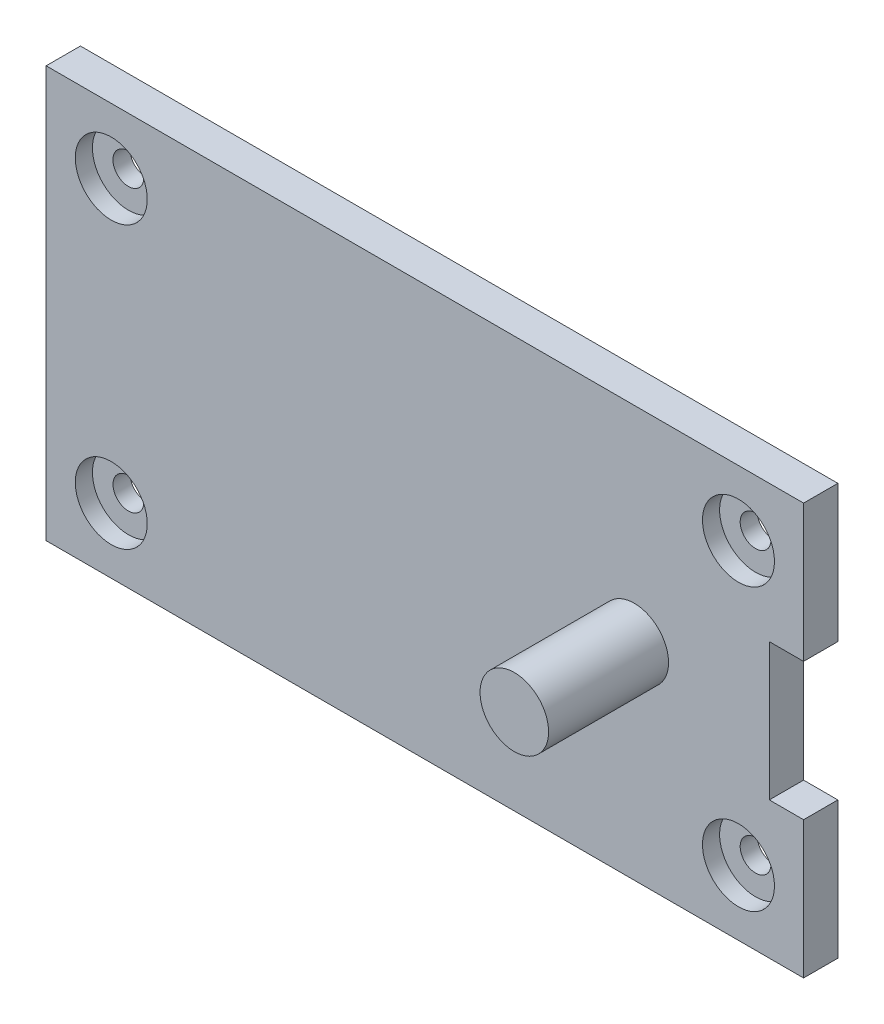
ISO-10303-21;
HEADER;
FILE_DESCRIPTION(('STEP AP214'),'2;1');
FILE_NAME('part.step','',(''),(''),'','','');
FILE_SCHEMA(('AUTOMOTIVE_DESIGN { 1 0 10303 214 1 1 1 1 }'));
ENDSEC;
DATA;
#1=APPLICATION_CONTEXT('core data for automotive mechanical design processes');
#2=APPLICATION_PROTOCOL_DEFINITION('international standard','automotive_design',2000,#1);
#3=PRODUCT_CONTEXT('',#1,'mechanical');
#4=PRODUCT('Part','Part','',(#3));
#5=PRODUCT_RELATED_PRODUCT_CATEGORY('part','',(#4));
#6=PRODUCT_DEFINITION_FORMATION('','',#4);
#7=PRODUCT_DEFINITION_CONTEXT('part definition',#1,'design');
#8=PRODUCT_DEFINITION('design','',#6,#7);
#9=PRODUCT_DEFINITION_SHAPE('','',#8);
#10=(LENGTH_UNIT() NAMED_UNIT(*) SI_UNIT(.MILLI.,.METRE.));
#11=(NAMED_UNIT(*) PLANE_ANGLE_UNIT() SI_UNIT($,.RADIAN.));
#12=(NAMED_UNIT(*) SI_UNIT($,.STERADIAN.) SOLID_ANGLE_UNIT());
#13=UNCERTAINTY_MEASURE_WITH_UNIT(LENGTH_MEASURE(1.E-05),#10,'distance_accuracy_value','');
#14=(GEOMETRIC_REPRESENTATION_CONTEXT(3) GLOBAL_UNCERTAINTY_ASSIGNED_CONTEXT((#13)) GLOBAL_UNIT_ASSIGNED_CONTEXT((#10,
#11,#12)) REPRESENTATION_CONTEXT('',''));
#15=CARTESIAN_POINT('',(0.,0.,0.));
#16=DIRECTION('',(0.,0.,1.));
#17=DIRECTION('',(1.,0.,0.));
#18=AXIS2_PLACEMENT_3D('',#15,#16,#17);
#19=CARTESIAN_POINT('',(1.8,1.8,21.));
#20=DIRECTION('',(0.,0.,-1.));
#21=DIRECTION('',(-1.,0.,0.));
#22=AXIS2_PLACEMENT_3D('',#19,#20,#21);
#23=CYLINDRICAL_SURFACE('',#22,0.899999999999996);
#24=CARTESIAN_POINT('',(1.8,1.8,11.));
#25=DIRECTION('',(0.,0.,-1.));
#26=DIRECTION('',(-1.,0.,0.));
#27=AXIS2_PLACEMENT_3D('',#24,#25,#26);
#28=CIRCLE('',#27,0.899999999999996);
#29=CARTESIAN_POINT('',(0.900000000000007,1.8,11.));
#30=VERTEX_POINT('',#29);
#31=EDGE_CURVE('E177',#30,#30,#28,.T.);
#32=ORIENTED_EDGE('',*,*,#31,.T.);
#33=EDGE_LOOP('',(#32));
#34=FACE_BOUND('',#33,.T.);
#35=CARTESIAN_POINT('',(1.8,1.8,12.));
#36=DIRECTION('',(0.,0.,1.));
#37=DIRECTION('',(1.,0.,0.));
#38=AXIS2_PLACEMENT_3D('',#35,#36,#37);
#39=CIRCLE('',#38,0.899999999999996);
#40=CARTESIAN_POINT('',(2.7,1.8,12.));
#41=VERTEX_POINT('',#40);
#42=EDGE_CURVE('E37',#41,#41,#39,.F.);
#43=ORIENTED_EDGE('',*,*,#42,.F.);
#44=EDGE_LOOP('',(#43));
#45=FACE_BOUND('',#44,.T.);
#46=ADVANCED_FACE('F33',(#34,#45),#23,.F.);
#47=CARTESIAN_POINT('',(38.4,1.8,21.));
#48=DIRECTION('',(0.,0.,-1.));
#49=DIRECTION('',(-1.,0.,0.));
#50=AXIS2_PLACEMENT_3D('',#47,#48,#49);
#51=CYLINDRICAL_SURFACE('',#50,0.899999999999996);
#52=CARTESIAN_POINT('',(38.4,1.8,11.));
#53=DIRECTION('',(0.,0.,-1.));
#54=DIRECTION('',(1.,0.,0.));
#55=AXIS2_PLACEMENT_3D('',#52,#53,#54);
#56=CIRCLE('',#55,0.899999999999996);
#57=CARTESIAN_POINT('',(39.3,1.8,11.));
#58=VERTEX_POINT('',#57);
#59=EDGE_CURVE('E174',#58,#58,#56,.T.);
#60=ORIENTED_EDGE('',*,*,#59,.T.);
#61=EDGE_LOOP('',(#60));
#62=FACE_BOUND('',#61,.T.);
#63=CARTESIAN_POINT('',(38.4,1.8,12.));
#64=DIRECTION('',(0.,0.,1.));
#65=DIRECTION('',(1.,0.,0.));
#66=AXIS2_PLACEMENT_3D('',#63,#64,#65);
#67=CIRCLE('',#66,0.899999999999996);
#68=CARTESIAN_POINT('',(39.3,1.8,12.));
#69=VERTEX_POINT('',#68);
#70=EDGE_CURVE('E142',#69,#69,#67,.F.);
#71=ORIENTED_EDGE('',*,*,#70,.F.);
#72=EDGE_LOOP('',(#71));
#73=FACE_BOUND('',#72,.T.);
#74=ADVANCED_FACE('F241',(#62,#73),#51,.F.);
#75=CARTESIAN_POINT('',(38.4,18.2,21.));
#76=DIRECTION('',(0.,0.,-1.));
#77=DIRECTION('',(-1.,0.,0.));
#78=AXIS2_PLACEMENT_3D('',#75,#76,#77);
#79=CYLINDRICAL_SURFACE('',#78,0.899999999999996);
#80=CARTESIAN_POINT('',(38.4,18.2,11.));
#81=DIRECTION('',(0.,0.,-1.));
#82=DIRECTION('',(-1.,0.,0.));
#83=AXIS2_PLACEMENT_3D('',#80,#81,#82);
#84=CIRCLE('',#83,0.899999999999996);
#85=CARTESIAN_POINT('',(37.5,18.2,11.));
#86=VERTEX_POINT('',#85);
#87=EDGE_CURVE('E183',#86,#86,#84,.T.);
#88=ORIENTED_EDGE('',*,*,#87,.T.);
#89=EDGE_LOOP('',(#88));
#90=FACE_BOUND('',#89,.T.);
#91=CARTESIAN_POINT('',(38.4,18.2,12.));
#92=DIRECTION('',(0.,0.,1.));
#93=DIRECTION('',(1.,0.,0.));
#94=AXIS2_PLACEMENT_3D('',#91,#92,#93);
#95=CIRCLE('',#94,0.899999999999996);
#96=CARTESIAN_POINT('',(39.3,18.2,12.));
#97=VERTEX_POINT('',#96);
#98=EDGE_CURVE('E138',#97,#97,#95,.F.);
#99=ORIENTED_EDGE('',*,*,#98,.F.);
#100=EDGE_LOOP('',(#99));
#101=FACE_BOUND('',#100,.T.);
#102=ADVANCED_FACE('F247',(#90,#101),#79,.F.);
#103=CARTESIAN_POINT('',(1.8,18.2,21.));
#104=DIRECTION('',(0.,0.,-1.));
#105=DIRECTION('',(-1.,0.,0.));
#106=AXIS2_PLACEMENT_3D('',#103,#104,#105);
#107=CYLINDRICAL_SURFACE('',#106,0.899999999999996);
#108=CARTESIAN_POINT('',(1.8,18.2,11.));
#109=DIRECTION('',(0.,0.,-1.));
#110=DIRECTION('',(1.,0.,0.));
#111=AXIS2_PLACEMENT_3D('',#108,#109,#110);
#112=CIRCLE('',#111,0.899999999999996);
#113=CARTESIAN_POINT('',(2.7,18.2,11.));
#114=VERTEX_POINT('',#113);
#115=EDGE_CURVE('E180',#114,#114,#112,.T.);
#116=ORIENTED_EDGE('',*,*,#115,.T.);
#117=EDGE_LOOP('',(#116));
#118=FACE_BOUND('',#117,.T.);
#119=CARTESIAN_POINT('',(1.8,18.2,12.));
#120=DIRECTION('',(0.,0.,1.));
#121=DIRECTION('',(1.,0.,0.));
#122=AXIS2_PLACEMENT_3D('',#119,#120,#121);
#123=CIRCLE('',#122,0.899999999999996);
#124=CARTESIAN_POINT('',(2.7,18.2,12.));
#125=VERTEX_POINT('',#124);
#126=EDGE_CURVE('E121',#125,#125,#123,.F.);
#127=ORIENTED_EDGE('',*,*,#126,.F.);
#128=EDGE_LOOP('',(#127));
#129=FACE_BOUND('',#128,.T.);
#130=ADVANCED_FACE('F253',(#118,#129),#107,.F.);
#131=CARTESIAN_POINT('',(42.2,22.,11.));
#132=DIRECTION('',(-1.,0.,0.));
#133=DIRECTION('',(0.,0.,1.));
#134=AXIS2_PLACEMENT_3D('',#131,#132,#133);
#135=PLANE('',#134);
#136=DIRECTION('',(0.,0.,-1.));
#137=VECTOR('',#136,1.);
#138=CARTESIAN_POINT('',(42.2,-2.,11.));
#139=LINE('',#138,#137);
#140=CARTESIAN_POINT('',(42.2,-2.,13.));
#141=VERTEX_POINT('',#140);
#142=CARTESIAN_POINT('',(42.2,-2.,11.));
#143=VERTEX_POINT('',#142);
#144=EDGE_CURVE('E42',#141,#143,#139,.T.);
#145=ORIENTED_EDGE('',*,*,#144,.T.);
#146=DIRECTION('',(0.,1.,0.));
#147=VECTOR('',#146,1.);
#148=CARTESIAN_POINT('',(42.2,-78.,11.));
#149=LINE('',#148,#147);
#150=CARTESIAN_POINT('',(42.2,6.00000000000001,11.));
#151=VERTEX_POINT('',#150);
#152=EDGE_CURVE('E167',#143,#151,#149,.T.);
#153=ORIENTED_EDGE('',*,*,#152,.T.);
#154=DIRECTION('',(0.,0.,-1.));
#155=VECTOR('',#154,1.);
#156=CARTESIAN_POINT('',(42.2,6.,13.));
#157=LINE('',#156,#155);
#158=CARTESIAN_POINT('',(42.2,6.,13.));
#159=VERTEX_POINT('',#158);
#160=EDGE_CURVE('E190',#159,#151,#157,.T.);
#161=ORIENTED_EDGE('',*,*,#160,.F.);
#162=DIRECTION('',(0.,1.,0.));
#163=VECTOR('',#162,1.);
#164=CARTESIAN_POINT('',(42.2,22.,13.));
#165=LINE('',#164,#163);
#166=EDGE_CURVE('E129',#141,#159,#165,.T.);
#167=ORIENTED_EDGE('',*,*,#166,.F.);
#168=EDGE_LOOP('',(#145,#153,#161,#167));
#169=FACE_BOUND('',#168,.T.);
#170=ADVANCED_FACE('F230',(#169),#135,.F.);
#171=CARTESIAN_POINT('',(-2.,22.,11.));
#172=DIRECTION('',(1.,0.,0.));
#173=DIRECTION('',(0.,1.,0.));
#174=AXIS2_PLACEMENT_3D('',#171,#172,#173);
#175=PLANE('',#174);
#176=DIRECTION('',(0.,0.,-1.));
#177=VECTOR('',#176,1.);
#178=CARTESIAN_POINT('',(-2.,22.,11.));
#179=LINE('',#178,#177);
#180=CARTESIAN_POINT('',(-2.,22.,13.));
#181=VERTEX_POINT('',#180);
#182=CARTESIAN_POINT('',(-2.,22.,11.));
#183=VERTEX_POINT('',#182);
#184=EDGE_CURVE('E117',#181,#183,#179,.T.);
#185=ORIENTED_EDGE('',*,*,#184,.T.);
#186=DIRECTION('',(0.,1.,0.));
#187=VECTOR('',#186,1.);
#188=CARTESIAN_POINT('',(-2.,-78.,11.));
#189=LINE('',#188,#187);
#190=CARTESIAN_POINT('',(-2.,-2.,11.));
#191=VERTEX_POINT('',#190);
#192=EDGE_CURVE('E100',#191,#183,#189,.T.);
#193=ORIENTED_EDGE('',*,*,#192,.F.);
#194=DIRECTION('',(0.,0.,-1.));
#195=VECTOR('',#194,1.);
#196=CARTESIAN_POINT('',(-2.,-2.,11.));
#197=LINE('',#196,#195);
#198=CARTESIAN_POINT('',(-2.,-2.,13.));
#199=VERTEX_POINT('',#198);
#200=EDGE_CURVE('E11',#199,#191,#197,.T.);
#201=ORIENTED_EDGE('',*,*,#200,.F.);
#202=DIRECTION('',(0.,-1.,0.));
#203=VECTOR('',#202,1.);
#204=CARTESIAN_POINT('',(-2.,22.,13.));
#205=LINE('',#204,#203);
#206=EDGE_CURVE('E125',#181,#199,#205,.T.);
#207=ORIENTED_EDGE('',*,*,#206,.F.);
#208=EDGE_LOOP('',(#185,#193,#201,#207));
#209=FACE_BOUND('',#208,.T.);
#210=ADVANCED_FACE('F35',(#209),#175,.F.);
#211=CARTESIAN_POINT('',(-2.,-2.,11.));
#212=DIRECTION('',(0.,1.,0.));
#213=DIRECTION('',(0.,0.,1.));
#214=AXIS2_PLACEMENT_3D('',#211,#212,#213);
#215=PLANE('',#214);
#216=ORIENTED_EDGE('',*,*,#200,.T.);
#217=DIRECTION('',(1.,0.,0.));
#218=VECTOR('',#217,1.);
#219=CARTESIAN_POINT('',(-2.,-2.,11.));
#220=LINE('',#219,#218);
#221=EDGE_CURVE('E108',#191,#143,#220,.T.);
#222=ORIENTED_EDGE('',*,*,#221,.T.);
#223=ORIENTED_EDGE('',*,*,#144,.F.);
#224=DIRECTION('',(1.,0.,0.));
#225=VECTOR('',#224,1.);
#226=CARTESIAN_POINT('',(-2.,-2.,13.));
#227=LINE('',#226,#225);
#228=EDGE_CURVE('E210',#199,#141,#227,.T.);
#229=ORIENTED_EDGE('',*,*,#228,.F.);
#230=EDGE_LOOP('',(#216,#222,#223,#229));
#231=FACE_BOUND('',#230,.T.);
#232=ADVANCED_FACE('F232',(#231),#215,.F.);
#233=DIRECTION('',(0.,0.,1.));
#234=VECTOR('',#233,1.);
#235=CARTESIAN_POINT('',(42.2,14.,13.));
#236=LINE('',#235,#234);
#237=CARTESIAN_POINT('',(42.2,14.,11.));
#238=VERTEX_POINT('',#237);
#239=CARTESIAN_POINT('',(42.2,14.,13.));
#240=VERTEX_POINT('',#239);
#241=EDGE_CURVE('E197',#238,#240,#236,.T.);
#242=ORIENTED_EDGE('',*,*,#241,.F.);
#243=CARTESIAN_POINT('',(42.2,22.,11.));
#244=VERTEX_POINT('',#243);
#245=EDGE_CURVE('E111',#238,#244,#149,.T.);
#246=ORIENTED_EDGE('',*,*,#245,.T.);
#247=DIRECTION('',(0.,0.,-1.));
#248=VECTOR('',#247,1.);
#249=CARTESIAN_POINT('',(42.2,22.,11.));
#250=LINE('',#249,#248);
#251=CARTESIAN_POINT('',(42.2,22.,13.));
#252=VERTEX_POINT('',#251);
#253=EDGE_CURVE('E120',#252,#244,#250,.T.);
#254=ORIENTED_EDGE('',*,*,#253,.F.);
#255=EDGE_CURVE('E212',#240,#252,#165,.T.);
#256=ORIENTED_EDGE('',*,*,#255,.F.);
#257=EDGE_LOOP('',(#242,#246,#254,#256));
#258=FACE_BOUND('',#257,.T.);
#259=ADVANCED_FACE('F222',(#258),#135,.F.);
#260=CARTESIAN_POINT('',(-2.,22.,11.));
#261=DIRECTION('',(0.,-1.,0.));
#262=DIRECTION('',(0.,0.,-1.));
#263=AXIS2_PLACEMENT_3D('',#260,#261,#262);
#264=PLANE('',#263);
#265=ORIENTED_EDGE('',*,*,#253,.T.);
#266=DIRECTION('',(1.,0.,0.));
#267=VECTOR('',#266,1.);
#268=CARTESIAN_POINT('',(-2.,22.,11.));
#269=LINE('',#268,#267);
#270=EDGE_CURVE('E105',#183,#244,#269,.T.);
#271=ORIENTED_EDGE('',*,*,#270,.F.);
#272=ORIENTED_EDGE('',*,*,#184,.F.);
#273=DIRECTION('',(-1.,0.,0.));
#274=VECTOR('',#273,1.);
#275=CARTESIAN_POINT('',(-2.,22.,13.));
#276=LINE('',#275,#274);
#277=EDGE_CURVE('E126',#252,#181,#276,.T.);
#278=ORIENTED_EDGE('',*,*,#277,.F.);
#279=EDGE_LOOP('',(#265,#271,#272,#278));
#280=FACE_BOUND('',#279,.T.);
#281=ADVANCED_FACE('F115',(#280),#264,.F.);
#282=CARTESIAN_POINT('',(0.,0.,11.));
#283=DIRECTION('',(0.,0.,1.));
#284=DIRECTION('',(1.,0.,0.));
#285=AXIS2_PLACEMENT_3D('',#282,#283,#284);
#286=PLANE('',#285);
#287=DIRECTION('',(0.,1.,0.));
#288=VECTOR('',#287,1.);
#289=CARTESIAN_POINT('',(40.2,0.,11.));
#290=LINE('',#289,#288);
#291=CARTESIAN_POINT('',(40.2,6.,11.));
#292=VERTEX_POINT('',#291);
#293=CARTESIAN_POINT('',(40.2,14.,11.));
#294=VERTEX_POINT('',#293);
#295=EDGE_CURVE('E205',#292,#294,#290,.T.);
#296=ORIENTED_EDGE('',*,*,#295,.F.);
#297=DIRECTION('',(-1.,0.,0.));
#298=VECTOR('',#297,1.);
#299=CARTESIAN_POINT('',(40.2,6.,11.));
#300=LINE('',#299,#298);
#301=EDGE_CURVE('E50',#151,#292,#300,.T.);
#302=ORIENTED_EDGE('',*,*,#301,.F.);
#303=ORIENTED_EDGE('',*,*,#152,.F.);
#304=ORIENTED_EDGE('',*,*,#221,.F.);
#305=ORIENTED_EDGE('',*,*,#192,.T.);
#306=ORIENTED_EDGE('',*,*,#270,.T.);
#307=ORIENTED_EDGE('',*,*,#245,.F.);
#308=DIRECTION('',(1.,0.,0.));
#309=VECTOR('',#308,1.);
#310=CARTESIAN_POINT('',(40.2,14.,11.));
#311=LINE('',#310,#309);
#312=EDGE_CURVE('E170',#294,#238,#311,.T.);
#313=ORIENTED_EDGE('',*,*,#312,.F.);
#314=EDGE_LOOP('',(#296,#302,#303,#304,#305,#306,#307,#313));
#315=FACE_BOUND('',#314,.T.);
#316=ORIENTED_EDGE('',*,*,#59,.F.);
#317=EDGE_LOOP('',(#316));
#318=FACE_BOUND('',#317,.T.);
#319=ORIENTED_EDGE('',*,*,#31,.F.);
#320=EDGE_LOOP('',(#319));
#321=FACE_BOUND('',#320,.T.);
#322=ORIENTED_EDGE('',*,*,#115,.F.);
#323=EDGE_LOOP('',(#322));
#324=FACE_BOUND('',#323,.T.);
#325=ORIENTED_EDGE('',*,*,#87,.F.);
#326=EDGE_LOOP('',(#325));
#327=FACE_BOUND('',#326,.T.);
#328=ADVANCED_FACE('F103',(#315,#318,#321,#324,#327),#286,.F.);
#329=CARTESIAN_POINT('',(0.,0.,13.));
#330=DIRECTION('',(0.,0.,1.));
#331=DIRECTION('',(1.,0.,0.));
#332=AXIS2_PLACEMENT_3D('',#329,#330,#331);
#333=PLANE('',#332);
#334=CARTESIAN_POINT('',(1.8,1.8,13.));
#335=DIRECTION('',(0.,0.,1.));
#336=DIRECTION('',(1.,0.,0.));
#337=AXIS2_PLACEMENT_3D('',#334,#335,#336);
#338=CIRCLE('',#337,2.1);
#339=CARTESIAN_POINT('',(3.9,1.8,13.));
#340=VERTEX_POINT('',#339);
#341=EDGE_CURVE('E158',#340,#340,#338,.T.);
#342=ORIENTED_EDGE('',*,*,#341,.F.);
#343=EDGE_LOOP('',(#342));
#344=FACE_BOUND('',#343,.T.);
#345=CARTESIAN_POINT('',(38.4,1.8,13.));
#346=DIRECTION('',(0.,0.,1.));
#347=DIRECTION('',(1.,0.,0.));
#348=AXIS2_PLACEMENT_3D('',#345,#346,#347);
#349=CIRCLE('',#348,2.1);
#350=CARTESIAN_POINT('',(40.5,1.8,13.));
#351=VERTEX_POINT('',#350);
#352=EDGE_CURVE('E151',#351,#351,#349,.T.);
#353=ORIENTED_EDGE('',*,*,#352,.F.);
#354=EDGE_LOOP('',(#353));
#355=FACE_BOUND('',#354,.T.);
#356=CARTESIAN_POINT('',(38.4,18.2,13.));
#357=DIRECTION('',(0.,0.,1.));
#358=DIRECTION('',(1.,0.,0.));
#359=AXIS2_PLACEMENT_3D('',#356,#357,#358);
#360=CIRCLE('',#359,2.1);
#361=CARTESIAN_POINT('',(40.5,18.2,13.));
#362=VERTEX_POINT('',#361);
#363=EDGE_CURVE('E144',#362,#362,#360,.T.);
#364=ORIENTED_EDGE('',*,*,#363,.F.);
#365=EDGE_LOOP('',(#364));
#366=FACE_BOUND('',#365,.T.);
#367=CARTESIAN_POINT('',(1.8,18.2,13.));
#368=DIRECTION('',(0.,0.,1.));
#369=DIRECTION('',(1.,0.,0.));
#370=AXIS2_PLACEMENT_3D('',#367,#368,#369);
#371=CIRCLE('',#370,2.1);
#372=CARTESIAN_POINT('',(3.9,18.2,13.));
#373=VERTEX_POINT('',#372);
#374=EDGE_CURVE('E140',#373,#373,#371,.T.);
#375=ORIENTED_EDGE('',*,*,#374,.F.);
#376=EDGE_LOOP('',(#375));
#377=FACE_BOUND('',#376,.T.);
#378=CARTESIAN_POINT('',(32.32,10.,13.));
#379=DIRECTION('',(0.,0.,1.));
#380=DIRECTION('',(1.,0.,0.));
#381=AXIS2_PLACEMENT_3D('',#378,#379,#380);
#382=CIRCLE('',#381,2.);
#383=CARTESIAN_POINT('',(34.32,10.,13.));
#384=VERTEX_POINT('',#383);
#385=EDGE_CURVE('E186',#384,#384,#382,.T.);
#386=ORIENTED_EDGE('',*,*,#385,.F.);
#387=EDGE_LOOP('',(#386));
#388=FACE_BOUND('',#387,.T.);
#389=DIRECTION('',(1.,0.,0.));
#390=VECTOR('',#389,1.);
#391=CARTESIAN_POINT('',(40.2,14.,13.));
#392=LINE('',#391,#390);
#393=CARTESIAN_POINT('',(40.2,14.,13.));
#394=VERTEX_POINT('',#393);
#395=EDGE_CURVE('E58',#394,#240,#392,.T.);
#396=ORIENTED_EDGE('',*,*,#395,.T.);
#397=ORIENTED_EDGE('',*,*,#255,.T.);
#398=ORIENTED_EDGE('',*,*,#277,.T.);
#399=ORIENTED_EDGE('',*,*,#206,.T.);
#400=ORIENTED_EDGE('',*,*,#228,.T.);
#401=ORIENTED_EDGE('',*,*,#166,.T.);
#402=DIRECTION('',(1.,0.,0.));
#403=VECTOR('',#402,1.);
#404=CARTESIAN_POINT('',(40.2,6.,13.));
#405=LINE('',#404,#403);
#406=CARTESIAN_POINT('',(40.2,6.,13.));
#407=VERTEX_POINT('',#406);
#408=EDGE_CURVE('E201',#407,#159,#405,.T.);
#409=ORIENTED_EDGE('',*,*,#408,.F.);
#410=DIRECTION('',(0.,-1.,0.));
#411=VECTOR('',#410,1.);
#412=CARTESIAN_POINT('',(40.2,14.,13.));
#413=LINE('',#412,#411);
#414=EDGE_CURVE('E193',#394,#407,#413,.T.);
#415=ORIENTED_EDGE('',*,*,#414,.F.);
#416=EDGE_LOOP('',(#396,#397,#398,#399,#400,#401,#409,#415));
#417=FACE_BOUND('',#416,.T.);
#418=ADVANCED_FACE('F218',(#344,#355,#366,#377,#388,#417),#333,.T.);
#419=CARTESIAN_POINT('',(40.2,0.,0.));
#420=DIRECTION('',(1.,0.,0.));
#421=DIRECTION('',(0.,0.,-1.));
#422=AXIS2_PLACEMENT_3D('',#419,#420,#421);
#423=PLANE('',#422);
#424=ORIENTED_EDGE('',*,*,#295,.T.);
#425=DIRECTION('',(0.,0.,1.));
#426=VECTOR('',#425,1.);
#427=CARTESIAN_POINT('',(40.2,14.,13.));
#428=LINE('',#427,#426);
#429=EDGE_CURVE('E199',#294,#394,#428,.T.);
#430=ORIENTED_EDGE('',*,*,#429,.T.);
#431=ORIENTED_EDGE('',*,*,#414,.T.);
#432=DIRECTION('',(0.,0.,-1.));
#433=VECTOR('',#432,1.);
#434=CARTESIAN_POINT('',(40.2,6.,13.));
#435=LINE('',#434,#433);
#436=EDGE_CURVE('E196',#407,#292,#435,.T.);
#437=ORIENTED_EDGE('',*,*,#436,.T.);
#438=EDGE_LOOP('',(#424,#430,#431,#437));
#439=FACE_BOUND('',#438,.T.);
#440=ADVANCED_FACE('F225',(#439),#423,.T.);
#441=CARTESIAN_POINT('',(40.2,14.,13.));
#442=DIRECTION('',(0.,1.,0.));
#443=DIRECTION('',(0.,0.,1.));
#444=AXIS2_PLACEMENT_3D('',#441,#442,#443);
#445=PLANE('',#444);
#446=ORIENTED_EDGE('',*,*,#429,.F.);
#447=ORIENTED_EDGE('',*,*,#312,.T.);
#448=ORIENTED_EDGE('',*,*,#241,.T.);
#449=ORIENTED_EDGE('',*,*,#395,.F.);
#450=EDGE_LOOP('',(#446,#447,#448,#449));
#451=FACE_BOUND('',#450,.T.);
#452=ADVANCED_FACE('F223',(#451),#445,.F.);
#453=CARTESIAN_POINT('',(40.2,6.,13.));
#454=DIRECTION('',(0.,-1.,0.));
#455=DIRECTION('',(0.,0.,-1.));
#456=AXIS2_PLACEMENT_3D('',#453,#454,#455);
#457=PLANE('',#456);
#458=ORIENTED_EDGE('',*,*,#160,.T.);
#459=ORIENTED_EDGE('',*,*,#301,.T.);
#460=ORIENTED_EDGE('',*,*,#436,.F.);
#461=ORIENTED_EDGE('',*,*,#408,.T.);
#462=EDGE_LOOP('',(#458,#459,#460,#461));
#463=FACE_BOUND('',#462,.T.);
#464=ADVANCED_FACE('F227',(#463),#457,.F.);
#465=CARTESIAN_POINT('',(32.32,10.,20.));
#466=DIRECTION('',(0.,0.,-1.));
#467=DIRECTION('',(-1.,0.,0.));
#468=AXIS2_PLACEMENT_3D('',#465,#466,#467);
#469=CYLINDRICAL_SURFACE('',#468,2.);
#470=CARTESIAN_POINT('',(32.32,10.,20.));
#471=DIRECTION('',(0.,0.,1.));
#472=DIRECTION('',(1.,0.,0.));
#473=AXIS2_PLACEMENT_3D('',#470,#471,#472);
#474=CIRCLE('',#473,2.);
#475=CARTESIAN_POINT('',(34.32,10.,20.));
#476=VERTEX_POINT('',#475);
#477=EDGE_CURVE('E187',#476,#476,#474,.T.);
#478=ORIENTED_EDGE('',*,*,#477,.F.);
#479=EDGE_LOOP('',(#478));
#480=FACE_BOUND('',#479,.T.);
#481=ORIENTED_EDGE('',*,*,#385,.T.);
#482=EDGE_LOOP('',(#481));
#483=FACE_BOUND('',#482,.T.);
#484=ADVANCED_FACE('F264',(#480,#483),#469,.T.);
#485=CARTESIAN_POINT('',(32.32,10.,20.));
#486=DIRECTION('',(0.,0.,1.));
#487=DIRECTION('',(1.,0.,0.));
#488=AXIS2_PLACEMENT_3D('',#485,#486,#487);
#489=PLANE('',#488);
#490=ORIENTED_EDGE('',*,*,#477,.T.);
#491=EDGE_LOOP('',(#490));
#492=FACE_BOUND('',#491,.T.);
#493=ADVANCED_FACE('F260',(#492),#489,.T.);
#494=CARTESIAN_POINT('',(1.8,18.2,12.));
#495=DIRECTION('',(0.,0.,1.));
#496=DIRECTION('',(1.,0.,0.));
#497=AXIS2_PLACEMENT_3D('',#494,#495,#496);
#498=PLANE('',#497);
#499=CARTESIAN_POINT('',(1.8,18.2,12.));
#500=DIRECTION('',(0.,0.,1.));
#501=DIRECTION('',(1.,0.,0.));
#502=AXIS2_PLACEMENT_3D('',#499,#500,#501);
#503=CIRCLE('',#502,2.1);
#504=CARTESIAN_POINT('',(3.9,18.2,12.));
#505=VERTEX_POINT('',#504);
#506=EDGE_CURVE('E137',#505,#505,#503,.T.);
#507=ORIENTED_EDGE('',*,*,#506,.T.);
#508=EDGE_LOOP('',(#507));
#509=FACE_BOUND('',#508,.T.);
#510=ORIENTED_EDGE('',*,*,#126,.T.);
#511=EDGE_LOOP('',(#510));
#512=FACE_BOUND('',#511,.T.);
#513=ADVANCED_FACE('F263',(#509,#512),#498,.T.);
#514=CARTESIAN_POINT('',(1.8,18.2,12.));
#515=DIRECTION('',(0.,0.,1.));
#516=DIRECTION('',(1.,0.,0.));
#517=AXIS2_PLACEMENT_3D('',#514,#515,#516);
#518=CYLINDRICAL_SURFACE('',#517,2.1);
#519=ORIENTED_EDGE('',*,*,#506,.F.);
#520=EDGE_LOOP('',(#519));
#521=FACE_BOUND('',#520,.T.);
#522=ORIENTED_EDGE('',*,*,#374,.T.);
#523=EDGE_LOOP('',(#522));
#524=FACE_BOUND('',#523,.T.);
#525=ADVANCED_FACE('F321',(#521,#524),#518,.F.);
#526=CARTESIAN_POINT('',(38.4,18.2,12.));
#527=DIRECTION('',(0.,0.,1.));
#528=DIRECTION('',(1.,0.,0.));
#529=AXIS2_PLACEMENT_3D('',#526,#527,#528);
#530=PLANE('',#529);
#531=CARTESIAN_POINT('',(38.4,18.2,12.));
#532=DIRECTION('',(0.,0.,1.));
#533=DIRECTION('',(1.,0.,0.));
#534=AXIS2_PLACEMENT_3D('',#531,#532,#533);
#535=CIRCLE('',#534,2.1);
#536=CARTESIAN_POINT('',(40.5,18.2,12.));
#537=VERTEX_POINT('',#536);
#538=EDGE_CURVE('E141',#537,#537,#535,.T.);
#539=ORIENTED_EDGE('',*,*,#538,.T.);
#540=EDGE_LOOP('',(#539));
#541=FACE_BOUND('',#540,.T.);
#542=ORIENTED_EDGE('',*,*,#98,.T.);
#543=EDGE_LOOP('',(#542));
#544=FACE_BOUND('',#543,.T.);
#545=ADVANCED_FACE('F329',(#541,#544),#530,.T.);
#546=CARTESIAN_POINT('',(38.4,18.2,12.));
#547=DIRECTION('',(0.,0.,1.));
#548=DIRECTION('',(1.,0.,0.));
#549=AXIS2_PLACEMENT_3D('',#546,#547,#548);
#550=CYLINDRICAL_SURFACE('',#549,2.1);
#551=ORIENTED_EDGE('',*,*,#538,.F.);
#552=EDGE_LOOP('',(#551));
#553=FACE_BOUND('',#552,.T.);
#554=ORIENTED_EDGE('',*,*,#363,.T.);
#555=EDGE_LOOP('',(#554));
#556=FACE_BOUND('',#555,.T.);
#557=ADVANCED_FACE('F336',(#553,#556),#550,.F.);
#558=CARTESIAN_POINT('',(38.4,1.8,12.));
#559=DIRECTION('',(0.,0.,1.));
#560=DIRECTION('',(1.,0.,0.));
#561=AXIS2_PLACEMENT_3D('',#558,#559,#560);
#562=PLANE('',#561);
#563=CARTESIAN_POINT('',(38.4,1.8,12.));
#564=DIRECTION('',(0.,0.,1.));
#565=DIRECTION('',(1.,0.,0.));
#566=AXIS2_PLACEMENT_3D('',#563,#564,#565);
#567=CIRCLE('',#566,2.1);
#568=CARTESIAN_POINT('',(40.5,1.8,12.));
#569=VERTEX_POINT('',#568);
#570=EDGE_CURVE('E145',#569,#569,#567,.T.);
#571=ORIENTED_EDGE('',*,*,#570,.T.);
#572=EDGE_LOOP('',(#571));
#573=FACE_BOUND('',#572,.T.);
#574=ORIENTED_EDGE('',*,*,#70,.T.);
#575=EDGE_LOOP('',(#574));
#576=FACE_BOUND('',#575,.T.);
#577=ADVANCED_FACE('F344',(#573,#576),#562,.T.);
#578=CARTESIAN_POINT('',(38.4,1.8,12.));
#579=DIRECTION('',(0.,0.,1.));
#580=DIRECTION('',(1.,0.,0.));
#581=AXIS2_PLACEMENT_3D('',#578,#579,#580);
#582=CYLINDRICAL_SURFACE('',#581,2.1);
#583=ORIENTED_EDGE('',*,*,#570,.F.);
#584=EDGE_LOOP('',(#583));
#585=FACE_BOUND('',#584,.T.);
#586=ORIENTED_EDGE('',*,*,#352,.T.);
#587=EDGE_LOOP('',(#586));
#588=FACE_BOUND('',#587,.T.);
#589=ADVANCED_FACE('F352',(#585,#588),#582,.F.);
#590=CARTESIAN_POINT('',(1.8,1.8,12.));
#591=DIRECTION('',(0.,0.,1.));
#592=DIRECTION('',(1.,0.,0.));
#593=AXIS2_PLACEMENT_3D('',#590,#591,#592);
#594=PLANE('',#593);
#595=CARTESIAN_POINT('',(1.8,1.8,12.));
#596=DIRECTION('',(0.,0.,1.));
#597=DIRECTION('',(1.,0.,0.));
#598=AXIS2_PLACEMENT_3D('',#595,#596,#597);
#599=CIRCLE('',#598,2.1);
#600=CARTESIAN_POINT('',(3.9,1.8,12.));
#601=VERTEX_POINT('',#600);
#602=EDGE_CURVE('E472',#601,#601,#599,.T.);
#603=ORIENTED_EDGE('',*,*,#602,.T.);
#604=EDGE_LOOP('',(#603));
#605=FACE_BOUND('',#604,.T.);
#606=ORIENTED_EDGE('',*,*,#42,.T.);
#607=EDGE_LOOP('',(#606));
#608=FACE_BOUND('',#607,.T.);
#609=ADVANCED_FACE('F359',(#605,#608),#594,.T.);
#610=CARTESIAN_POINT('',(1.8,1.8,12.));
#611=DIRECTION('',(0.,0.,1.));
#612=DIRECTION('',(1.,0.,0.));
#613=AXIS2_PLACEMENT_3D('',#610,#611,#612);
#614=CYLINDRICAL_SURFACE('',#613,2.1);
#615=ORIENTED_EDGE('',*,*,#602,.F.);
#616=EDGE_LOOP('',(#615));
#617=FACE_BOUND('',#616,.T.);
#618=ORIENTED_EDGE('',*,*,#341,.T.);
#619=EDGE_LOOP('',(#618));
#620=FACE_BOUND('',#619,.T.);
#621=ADVANCED_FACE('F367',(#617,#620),#614,.F.);
#622=CLOSED_SHELL('',(#46,#74,#102,#130,#170,#210,#232,#259,#281,#328,#418,#440,#452,#464,#484,
#493,#513,#525,#545,#557,#577,#589,#609,#621));
#623=MANIFOLD_SOLID_BREP('B2',#622);
#624=ADVANCED_BREP_SHAPE_REPRESENTATION('',(#18,#623),#14);
#625=SHAPE_DEFINITION_REPRESENTATION(#9,#624);
ENDSEC;
END-ISO-10303-21;
